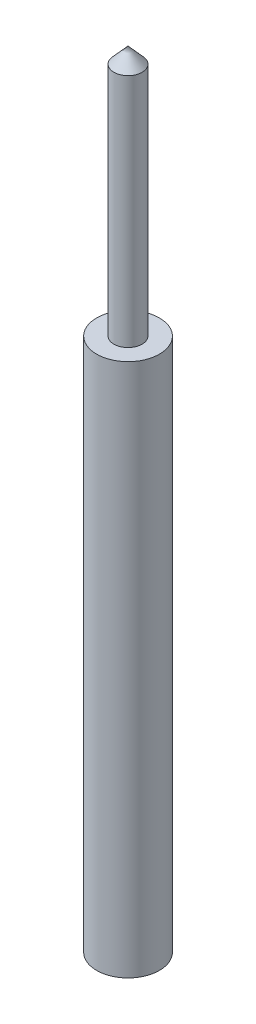
ISO-10303-21;
HEADER;
FILE_DESCRIPTION(('STEP AP214'),'2;1');
FILE_NAME('part.step','',(''),(''),'','','');
FILE_SCHEMA(('AUTOMOTIVE_DESIGN { 1 0 10303 214 1 1 1 1 }'));
ENDSEC;
DATA;
#1=APPLICATION_CONTEXT('core data for automotive mechanical design processes');
#2=APPLICATION_PROTOCOL_DEFINITION('international standard','automotive_design',2000,#1);
#3=PRODUCT_CONTEXT('',#1,'mechanical');
#4=PRODUCT('Part','Part','',(#3));
#5=PRODUCT_RELATED_PRODUCT_CATEGORY('part','',(#4));
#6=PRODUCT_DEFINITION_FORMATION('','',#4);
#7=PRODUCT_DEFINITION_CONTEXT('part definition',#1,'design');
#8=PRODUCT_DEFINITION('design','',#6,#7);
#9=PRODUCT_DEFINITION_SHAPE('','',#8);
#10=(LENGTH_UNIT() NAMED_UNIT(*) SI_UNIT(.MILLI.,.METRE.));
#11=(NAMED_UNIT(*) PLANE_ANGLE_UNIT() SI_UNIT($,.RADIAN.));
#12=(NAMED_UNIT(*) SI_UNIT($,.STERADIAN.) SOLID_ANGLE_UNIT());
#13=UNCERTAINTY_MEASURE_WITH_UNIT(LENGTH_MEASURE(1.E-05),#10,'distance_accuracy_value','');
#14=(GEOMETRIC_REPRESENTATION_CONTEXT(3) GLOBAL_UNCERTAINTY_ASSIGNED_CONTEXT((#13)) GLOBAL_UNIT_ASSIGNED_CONTEXT((#10,
#11,#12)) REPRESENTATION_CONTEXT('',''));
#15=CARTESIAN_POINT('',(0.,0.,0.));
#16=DIRECTION('',(0.,0.,1.));
#17=DIRECTION('',(1.,0.,0.));
#18=AXIS2_PLACEMENT_3D('',#15,#16,#17);
#19=CARTESIAN_POINT('',(0.,24.5,0.));
#20=DIRECTION('',(0.,-1.,0.));
#21=DIRECTION('',(0.,0.,-1.));
#22=AXIS2_PLACEMENT_3D('',#19,#20,#21);
#23=CONICAL_SURFACE('',#22,0.45,0.732815101786506);
#24=CARTESIAN_POINT('',(0.,25.,0.));
#25=VERTEX_POINT('',#24);
#26=VERTEX_LOOP('',#25);
#27=FACE_BOUND('',#26,.T.);
#28=CARTESIAN_POINT('',(0.,24.5,0.));
#29=DIRECTION('',(0.,-1.,0.));
#30=DIRECTION('',(0.,0.,-1.));
#31=AXIS2_PLACEMENT_3D('',#28,#29,#30);
#32=CIRCLE('',#31,0.45);
#33=CARTESIAN_POINT('',(0.,24.5,-0.45));
#34=VERTEX_POINT('',#33);
#35=EDGE_CURVE('E11',#34,#34,#32,.T.);
#36=ORIENTED_EDGE('',*,*,#35,.F.);
#37=EDGE_LOOP('',(#36));
#38=FACE_BOUND('',#37,.T.);
#39=ADVANCED_FACE('F32',(#27,#38),#23,.T.);
#40=CARTESIAN_POINT('',(0.,0.,0.));
#41=DIRECTION('',(0.,-1.,0.));
#42=DIRECTION('',(0.,0.,-1.));
#43=AXIS2_PLACEMENT_3D('',#40,#41,#42);
#44=CYLINDRICAL_SURFACE('',#43,0.45);
#45=ORIENTED_EDGE('',*,*,#35,.T.);
#46=EDGE_LOOP('',(#45));
#47=FACE_BOUND('',#46,.T.);
#48=CARTESIAN_POINT('',(0.,17.,0.));
#49=DIRECTION('',(0.,-1.,0.));
#50=DIRECTION('',(0.,0.,-1.));
#51=AXIS2_PLACEMENT_3D('',#48,#49,#50);
#52=CIRCLE('',#51,0.450000000000001);
#53=CARTESIAN_POINT('',(0.,17.,-0.450000000000001));
#54=VERTEX_POINT('',#53);
#55=EDGE_CURVE('E38',#54,#54,#52,.T.);
#56=ORIENTED_EDGE('',*,*,#55,.F.);
#57=EDGE_LOOP('',(#56));
#58=FACE_BOUND('',#57,.T.);
#59=ADVANCED_FACE('F43',(#47,#58),#44,.T.);
#60=CARTESIAN_POINT('',(0.450000000000001,17.,0.));
#61=DIRECTION('',(0.,1.,0.));
#62=DIRECTION('',(0.,0.,1.));
#63=AXIS2_PLACEMENT_3D('',#60,#61,#62);
#64=PLANE('',#63);
#65=ORIENTED_EDGE('',*,*,#55,.T.);
#66=EDGE_LOOP('',(#65));
#67=FACE_BOUND('',#66,.T.);
#68=CARTESIAN_POINT('',(0.,17.,0.));
#69=DIRECTION('',(0.,-1.,0.));
#70=DIRECTION('',(0.,0.,-1.));
#71=AXIS2_PLACEMENT_3D('',#68,#69,#70);
#72=CIRCLE('',#71,1.);
#73=CARTESIAN_POINT('',(0.,17.,-1.));
#74=VERTEX_POINT('',#73);
#75=EDGE_CURVE('E52',#74,#74,#72,.T.);
#76=ORIENTED_EDGE('',*,*,#75,.F.);
#77=EDGE_LOOP('',(#76));
#78=FACE_BOUND('',#77,.T.);
#79=ADVANCED_FACE('F48',(#67,#78),#64,.T.);
#80=CARTESIAN_POINT('',(0.,0.,0.));
#81=DIRECTION('',(0.,-1.,0.));
#82=DIRECTION('',(0.,0.,-1.));
#83=AXIS2_PLACEMENT_3D('',#80,#81,#82);
#84=CYLINDRICAL_SURFACE('',#83,1.);
#85=ORIENTED_EDGE('',*,*,#75,.T.);
#86=EDGE_LOOP('',(#85));
#87=FACE_BOUND('',#86,.T.);
#88=CARTESIAN_POINT('',(0.,0.,0.));
#89=DIRECTION('',(0.,-1.,0.));
#90=DIRECTION('',(0.,0.,-1.));
#91=AXIS2_PLACEMENT_3D('',#88,#89,#90);
#92=CIRCLE('',#91,1.);
#93=CARTESIAN_POINT('',(0.,0.,-1.));
#94=VERTEX_POINT('',#93);
#95=EDGE_CURVE('E54',#94,#94,#92,.T.);
#96=ORIENTED_EDGE('',*,*,#95,.F.);
#97=EDGE_LOOP('',(#96));
#98=FACE_BOUND('',#97,.T.);
#99=ADVANCED_FACE('F62',(#87,#98),#84,.T.);
#100=CARTESIAN_POINT('',(1.,0.,0.));
#101=DIRECTION('',(0.,-1.,0.));
#102=DIRECTION('',(0.,0.,-1.));
#103=AXIS2_PLACEMENT_3D('',#100,#101,#102);
#104=PLANE('',#103);
#105=ORIENTED_EDGE('',*,*,#95,.T.);
#106=EDGE_LOOP('',(#105));
#107=FACE_BOUND('',#106,.T.);
#108=ADVANCED_FACE('F60',(#107),#104,.T.);
#109=CLOSED_SHELL('',(#39,#59,#79,#99,#108));
#110=MANIFOLD_SOLID_BREP('B2',#109);
#111=ADVANCED_BREP_SHAPE_REPRESENTATION('',(#18,#110),#14);
#112=SHAPE_DEFINITION_REPRESENTATION(#9,#111);
ENDSEC;
END-ISO-10303-21;
